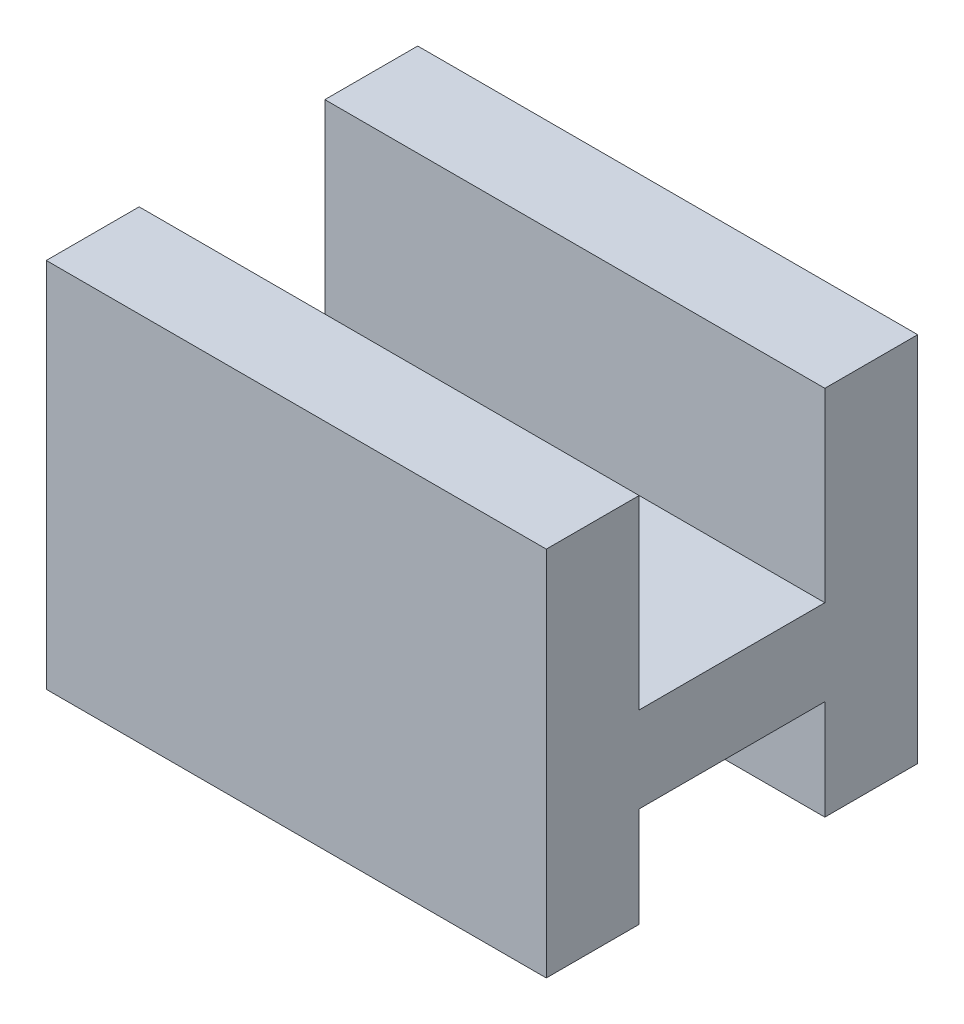
ISO-10303-21;
HEADER;
FILE_DESCRIPTION(('STEP AP214'),'2;1');
FILE_NAME('part.step','',(''),(''),'','','');
FILE_SCHEMA(('AUTOMOTIVE_DESIGN { 1 0 10303 214 1 1 1 1 }'));
ENDSEC;
DATA;
#1=APPLICATION_CONTEXT('core data for automotive mechanical design processes');
#2=APPLICATION_PROTOCOL_DEFINITION('international standard','automotive_design',2000,#1);
#3=PRODUCT_CONTEXT('',#1,'mechanical');
#4=PRODUCT('Part','Part','',(#3));
#5=PRODUCT_RELATED_PRODUCT_CATEGORY('part','',(#4));
#6=PRODUCT_DEFINITION_FORMATION('','',#4);
#7=PRODUCT_DEFINITION_CONTEXT('part definition',#1,'design');
#8=PRODUCT_DEFINITION('design','',#6,#7);
#9=PRODUCT_DEFINITION_SHAPE('','',#8);
#10=(LENGTH_UNIT() NAMED_UNIT(*) SI_UNIT(.MILLI.,.METRE.));
#11=(NAMED_UNIT(*) PLANE_ANGLE_UNIT() SI_UNIT($,.RADIAN.));
#12=(NAMED_UNIT(*) SI_UNIT($,.STERADIAN.) SOLID_ANGLE_UNIT());
#13=UNCERTAINTY_MEASURE_WITH_UNIT(LENGTH_MEASURE(1.E-05),#10,'distance_accuracy_value','');
#14=(GEOMETRIC_REPRESENTATION_CONTEXT(3) GLOBAL_UNCERTAINTY_ASSIGNED_CONTEXT((#13)) GLOBAL_UNIT_ASSIGNED_CONTEXT((#10,
#11,#12)) REPRESENTATION_CONTEXT('',''));
#15=CARTESIAN_POINT('',(0.,0.,0.));
#16=DIRECTION('',(0.,0.,1.));
#17=DIRECTION('',(1.,0.,0.));
#18=AXIS2_PLACEMENT_3D('',#15,#16,#17);
#19=CARTESIAN_POINT('',(-17.5,-13.,26.));
#20=DIRECTION('',(0.,1.,0.));
#21=DIRECTION('',(0.,0.,1.));
#22=AXIS2_PLACEMENT_3D('',#19,#20,#21);
#23=PLANE('',#22);
#24=DIRECTION('',(0.,0.,-1.));
#25=VECTOR('',#24,1.);
#26=CARTESIAN_POINT('',(17.5,-13.,26.));
#27=LINE('',#26,#25);
#28=CARTESIAN_POINT('',(17.5,-13.,6.5));
#29=VERTEX_POINT('',#28);
#30=CARTESIAN_POINT('',(17.5,-13.,0.));
#31=VERTEX_POINT('',#30);
#32=EDGE_CURVE('E139',#29,#31,#27,.T.);
#33=ORIENTED_EDGE('',*,*,#32,.F.);
#34=DIRECTION('',(-1.,0.,0.));
#35=VECTOR('',#34,1.);
#36=CARTESIAN_POINT('',(-17.5,-13.,6.5));
#37=LINE('',#36,#35);
#38=CARTESIAN_POINT('',(-17.5,-13.,6.5));
#39=VERTEX_POINT('',#38);
#40=EDGE_CURVE('E11',#29,#39,#37,.T.);
#41=ORIENTED_EDGE('',*,*,#40,.T.);
#42=DIRECTION('',(0.,0.,-1.));
#43=VECTOR('',#42,1.);
#44=CARTESIAN_POINT('',(-17.5,-13.,26.));
#45=LINE('',#44,#43);
#46=CARTESIAN_POINT('',(-17.5,-13.,0.));
#47=VERTEX_POINT('',#46);
#48=EDGE_CURVE('E137',#39,#47,#45,.T.);
#49=ORIENTED_EDGE('',*,*,#48,.T.);
#50=DIRECTION('',(1.,0.,0.));
#51=VECTOR('',#50,1.);
#52=CARTESIAN_POINT('',(-17.5,-13.,0.));
#53=LINE('',#52,#51);
#54=EDGE_CURVE('E175',#47,#31,#53,.T.);
#55=ORIENTED_EDGE('',*,*,#54,.T.);
#56=EDGE_LOOP('',(#33,#41,#49,#55));
#57=FACE_BOUND('',#56,.T.);
#58=ADVANCED_FACE('F33',(#57),#23,.F.);
#59=CARTESIAN_POINT('',(-17.5,13.,26.));
#60=DIRECTION('',(0.,-1.,0.));
#61=DIRECTION('',(0.,0.,-1.));
#62=AXIS2_PLACEMENT_3D('',#59,#60,#61);
#63=PLANE('',#62);
#64=DIRECTION('',(0.,0.,-1.));
#65=VECTOR('',#64,1.);
#66=CARTESIAN_POINT('',(-17.5,13.,26.));
#67=LINE('',#66,#65);
#68=CARTESIAN_POINT('',(-17.5,13.,6.5));
#69=VERTEX_POINT('',#68);
#70=CARTESIAN_POINT('',(-17.5,13.,0.));
#71=VERTEX_POINT('',#70);
#72=EDGE_CURVE('E148',#69,#71,#67,.T.);
#73=ORIENTED_EDGE('',*,*,#72,.F.);
#74=DIRECTION('',(-1.,0.,0.));
#75=VECTOR('',#74,1.);
#76=CARTESIAN_POINT('',(25.5,13.,6.5));
#77=LINE('',#76,#75);
#78=CARTESIAN_POINT('',(17.5,13.,6.5));
#79=VERTEX_POINT('',#78);
#80=EDGE_CURVE('E216',#79,#69,#77,.T.);
#81=ORIENTED_EDGE('',*,*,#80,.F.);
#82=DIRECTION('',(0.,0.,-1.));
#83=VECTOR('',#82,1.);
#84=CARTESIAN_POINT('',(17.5,13.,26.));
#85=LINE('',#84,#83);
#86=CARTESIAN_POINT('',(17.5,13.,0.));
#87=VERTEX_POINT('',#86);
#88=EDGE_CURVE('E156',#79,#87,#85,.T.);
#89=ORIENTED_EDGE('',*,*,#88,.T.);
#90=DIRECTION('',(-1.,0.,0.));
#91=VECTOR('',#90,1.);
#92=CARTESIAN_POINT('',(-17.5,13.,0.));
#93=LINE('',#92,#91);
#94=EDGE_CURVE('E189',#87,#71,#93,.T.);
#95=ORIENTED_EDGE('',*,*,#94,.T.);
#96=EDGE_LOOP('',(#73,#81,#89,#95));
#97=FACE_BOUND('',#96,.T.);
#98=ADVANCED_FACE('F195',(#97),#63,.F.);
#99=CARTESIAN_POINT('',(17.5,13.,26.));
#100=DIRECTION('',(-1.,0.,0.));
#101=DIRECTION('',(0.,-1.,0.));
#102=AXIS2_PLACEMENT_3D('',#99,#100,#101);
#103=PLANE('',#102);
#104=DIRECTION('',(0.,0.,-1.));
#105=VECTOR('',#104,1.);
#106=CARTESIAN_POINT('',(17.5,-5.99999999999999,26.));
#107=LINE('',#106,#105);
#108=CARTESIAN_POINT('',(17.5,-5.99999999999998,19.5));
#109=VERTEX_POINT('',#108);
#110=CARTESIAN_POINT('',(17.5,-5.99999999999999,6.5));
#111=VERTEX_POINT('',#110);
#112=EDGE_CURVE('E203',#109,#111,#107,.T.);
#113=ORIENTED_EDGE('',*,*,#112,.T.);
#114=DIRECTION('',(0.,-1.,0.));
#115=VECTOR('',#114,1.);
#116=CARTESIAN_POINT('',(17.5,13.,6.5));
#117=LINE('',#116,#115);
#118=EDGE_CURVE('E202',#111,#29,#117,.T.);
#119=ORIENTED_EDGE('',*,*,#118,.T.);
#120=ORIENTED_EDGE('',*,*,#32,.T.);
#121=DIRECTION('',(0.,1.,0.));
#122=VECTOR('',#121,1.);
#123=CARTESIAN_POINT('',(17.5,13.,0.));
#124=LINE('',#123,#122);
#125=EDGE_CURVE('E186',#31,#87,#124,.T.);
#126=ORIENTED_EDGE('',*,*,#125,.T.);
#127=ORIENTED_EDGE('',*,*,#88,.F.);
#128=DIRECTION('',(0.,-1.,0.));
#129=VECTOR('',#128,1.);
#130=CARTESIAN_POINT('',(17.5,13.,6.5));
#131=LINE('',#130,#129);
#132=CARTESIAN_POINT('',(17.5,0.,6.5));
#133=VERTEX_POINT('',#132);
#134=EDGE_CURVE('E180',#79,#133,#131,.T.);
#135=ORIENTED_EDGE('',*,*,#134,.T.);
#136=DIRECTION('',(0.,0.,1.));
#137=VECTOR('',#136,1.);
#138=CARTESIAN_POINT('',(17.5,0.,26.));
#139=LINE('',#138,#137);
#140=CARTESIAN_POINT('',(17.5,0.,19.5));
#141=VERTEX_POINT('',#140);
#142=EDGE_CURVE('E218',#133,#141,#139,.T.);
#143=ORIENTED_EDGE('',*,*,#142,.T.);
#144=DIRECTION('',(0.,1.,0.));
#145=VECTOR('',#144,1.);
#146=CARTESIAN_POINT('',(17.5,13.,19.5));
#147=LINE('',#146,#145);
#148=CARTESIAN_POINT('',(17.5,13.,19.5));
#149=VERTEX_POINT('',#148);
#150=EDGE_CURVE('E226',#141,#149,#147,.T.);
#151=ORIENTED_EDGE('',*,*,#150,.T.);
#152=CARTESIAN_POINT('',(17.5,13.,26.));
#153=VERTEX_POINT('',#152);
#154=EDGE_CURVE('E157',#153,#149,#85,.T.);
#155=ORIENTED_EDGE('',*,*,#154,.F.);
#156=DIRECTION('',(0.,1.,0.));
#157=VECTOR('',#156,1.);
#158=CARTESIAN_POINT('',(17.5,13.,26.));
#159=LINE('',#158,#157);
#160=CARTESIAN_POINT('',(17.5,-13.,26.));
#161=VERTEX_POINT('',#160);
#162=EDGE_CURVE('E171',#161,#153,#159,.T.);
#163=ORIENTED_EDGE('',*,*,#162,.F.);
#164=CARTESIAN_POINT('',(17.5,-13.,19.5));
#165=VERTEX_POINT('',#164);
#166=EDGE_CURVE('E145',#161,#165,#27,.T.);
#167=ORIENTED_EDGE('',*,*,#166,.T.);
#168=DIRECTION('',(0.,1.,0.));
#169=VECTOR('',#168,1.);
#170=CARTESIAN_POINT('',(17.5,13.,19.5));
#171=LINE('',#170,#169);
#172=EDGE_CURVE('E48',#165,#109,#171,.T.);
#173=ORIENTED_EDGE('',*,*,#172,.T.);
#174=EDGE_LOOP('',(#113,#119,#120,#126,#127,#135,#143,#151,#155,#163,#167,#173));
#175=FACE_BOUND('',#174,.T.);
#176=ADVANCED_FACE('F35',(#175),#103,.F.);
#177=ORIENTED_EDGE('',*,*,#154,.T.);
#178=DIRECTION('',(-1.,0.,0.));
#179=VECTOR('',#178,1.);
#180=CARTESIAN_POINT('',(25.5,13.,19.5));
#181=LINE('',#180,#179);
#182=CARTESIAN_POINT('',(-17.5,13.,19.5));
#183=VERTEX_POINT('',#182);
#184=EDGE_CURVE('E219',#149,#183,#181,.T.);
#185=ORIENTED_EDGE('',*,*,#184,.T.);
#186=CARTESIAN_POINT('',(-17.5,13.,26.));
#187=VERTEX_POINT('',#186);
#188=EDGE_CURVE('E153',#187,#183,#67,.T.);
#189=ORIENTED_EDGE('',*,*,#188,.F.);
#190=DIRECTION('',(-1.,0.,0.));
#191=VECTOR('',#190,1.);
#192=CARTESIAN_POINT('',(-17.5,13.,26.));
#193=LINE('',#192,#191);
#194=EDGE_CURVE('E174',#153,#187,#193,.T.);
#195=ORIENTED_EDGE('',*,*,#194,.F.);
#196=EDGE_LOOP('',(#177,#185,#189,#195));
#197=FACE_BOUND('',#196,.T.);
#198=ADVANCED_FACE('F238',(#197),#63,.F.);
#199=CARTESIAN_POINT('',(-17.5,13.,26.));
#200=DIRECTION('',(1.,0.,0.));
#201=DIRECTION('',(0.,1.,0.));
#202=AXIS2_PLACEMENT_3D('',#199,#200,#201);
#203=PLANE('',#202);
#204=ORIENTED_EDGE('',*,*,#48,.F.);
#205=DIRECTION('',(0.,-1.,0.));
#206=VECTOR('',#205,1.);
#207=CARTESIAN_POINT('',(-17.5,-13.,6.5));
#208=LINE('',#207,#206);
#209=CARTESIAN_POINT('',(-17.5,-6.,6.5));
#210=VERTEX_POINT('',#209);
#211=EDGE_CURVE('E123',#210,#39,#208,.T.);
#212=ORIENTED_EDGE('',*,*,#211,.F.);
#213=DIRECTION('',(0.,0.,-1.));
#214=VECTOR('',#213,1.);
#215=CARTESIAN_POINT('',(-17.5,-6.,6.5));
#216=LINE('',#215,#214);
#217=CARTESIAN_POINT('',(-17.5,-5.99999999999999,19.5));
#218=VERTEX_POINT('',#217);
#219=EDGE_CURVE('E240',#218,#210,#216,.T.);
#220=ORIENTED_EDGE('',*,*,#219,.F.);
#221=DIRECTION('',(0.,1.,0.));
#222=VECTOR('',#221,1.);
#223=CARTESIAN_POINT('',(-17.5,-13.,19.5));
#224=LINE('',#223,#222);
#225=CARTESIAN_POINT('',(-17.5,-13.,19.5));
#226=VERTEX_POINT('',#225);
#227=EDGE_CURVE('E132',#226,#218,#224,.T.);
#228=ORIENTED_EDGE('',*,*,#227,.F.);
#229=CARTESIAN_POINT('',(-17.5,-13.,26.));
#230=VERTEX_POINT('',#229);
#231=EDGE_CURVE('E144',#230,#226,#45,.T.);
#232=ORIENTED_EDGE('',*,*,#231,.F.);
#233=DIRECTION('',(0.,-1.,0.));
#234=VECTOR('',#233,1.);
#235=CARTESIAN_POINT('',(-17.5,13.,26.));
#236=LINE('',#235,#234);
#237=EDGE_CURVE('E177',#187,#230,#236,.T.);
#238=ORIENTED_EDGE('',*,*,#237,.F.);
#239=ORIENTED_EDGE('',*,*,#188,.T.);
#240=DIRECTION('',(0.,1.,0.));
#241=VECTOR('',#240,1.);
#242=CARTESIAN_POINT('',(-17.5,13.,19.5));
#243=LINE('',#242,#241);
#244=CARTESIAN_POINT('',(-17.5,0.,19.5));
#245=VERTEX_POINT('',#244);
#246=EDGE_CURVE('E213',#245,#183,#243,.T.);
#247=ORIENTED_EDGE('',*,*,#246,.F.);
#248=DIRECTION('',(0.,0.,1.));
#249=VECTOR('',#248,1.);
#250=CARTESIAN_POINT('',(-17.5,0.,6.5));
#251=LINE('',#250,#249);
#252=CARTESIAN_POINT('',(-17.5,0.,6.5));
#253=VERTEX_POINT('',#252);
#254=EDGE_CURVE('E210',#253,#245,#251,.T.);
#255=ORIENTED_EDGE('',*,*,#254,.F.);
#256=DIRECTION('',(0.,-1.,0.));
#257=VECTOR('',#256,1.);
#258=CARTESIAN_POINT('',(-17.5,13.,6.5));
#259=LINE('',#258,#257);
#260=EDGE_CURVE('E56',#69,#253,#259,.T.);
#261=ORIENTED_EDGE('',*,*,#260,.F.);
#262=ORIENTED_EDGE('',*,*,#72,.T.);
#263=DIRECTION('',(0.,-1.,0.));
#264=VECTOR('',#263,1.);
#265=CARTESIAN_POINT('',(-17.5,13.,0.));
#266=LINE('',#265,#264);
#267=EDGE_CURVE('E142',#71,#47,#266,.T.);
#268=ORIENTED_EDGE('',*,*,#267,.T.);
#269=EDGE_LOOP('',(#204,#212,#220,#228,#232,#238,#239,#247,#255,#261,#262,#268));
#270=FACE_BOUND('',#269,.T.);
#271=ADVANCED_FACE('F140',(#270),#203,.F.);
#272=ORIENTED_EDGE('',*,*,#231,.T.);
#273=DIRECTION('',(1.,0.,0.));
#274=VECTOR('',#273,1.);
#275=CARTESIAN_POINT('',(-17.5,-13.,19.5));
#276=LINE('',#275,#274);
#277=EDGE_CURVE('E41',#226,#165,#276,.T.);
#278=ORIENTED_EDGE('',*,*,#277,.T.);
#279=ORIENTED_EDGE('',*,*,#166,.F.);
#280=DIRECTION('',(1.,0.,0.));
#281=VECTOR('',#280,1.);
#282=CARTESIAN_POINT('',(-17.5,-13.,26.));
#283=LINE('',#282,#281);
#284=EDGE_CURVE('E184',#230,#161,#283,.T.);
#285=ORIENTED_EDGE('',*,*,#284,.F.);
#286=EDGE_LOOP('',(#272,#278,#279,#285));
#287=FACE_BOUND('',#286,.T.);
#288=ADVANCED_FACE('F161',(#287),#23,.F.);
#289=CARTESIAN_POINT('',(0.,0.,26.));
#290=DIRECTION('',(0.,0.,1.));
#291=DIRECTION('',(1.,0.,0.));
#292=AXIS2_PLACEMENT_3D('',#289,#290,#291);
#293=PLANE('',#292);
#294=ORIENTED_EDGE('',*,*,#162,.T.);
#295=ORIENTED_EDGE('',*,*,#194,.T.);
#296=ORIENTED_EDGE('',*,*,#237,.T.);
#297=ORIENTED_EDGE('',*,*,#284,.T.);
#298=EDGE_LOOP('',(#294,#295,#296,#297));
#299=FACE_BOUND('',#298,.T.);
#300=ADVANCED_FACE('F239',(#299),#293,.T.);
#301=CARTESIAN_POINT('',(0.,0.,0.));
#302=DIRECTION('',(0.,0.,1.));
#303=DIRECTION('',(1.,0.,0.));
#304=AXIS2_PLACEMENT_3D('',#301,#302,#303);
#305=PLANE('',#304);
#306=ORIENTED_EDGE('',*,*,#125,.F.);
#307=ORIENTED_EDGE('',*,*,#54,.F.);
#308=ORIENTED_EDGE('',*,*,#267,.F.);
#309=ORIENTED_EDGE('',*,*,#94,.F.);
#310=EDGE_LOOP('',(#306,#307,#308,#309));
#311=FACE_BOUND('',#310,.T.);
#312=ADVANCED_FACE('F200',(#311),#305,.F.);
#313=CARTESIAN_POINT('',(25.5,13.,6.5));
#314=DIRECTION('',(0.,0.,-1.));
#315=DIRECTION('',(0.,1.,0.));
#316=AXIS2_PLACEMENT_3D('',#313,#314,#315);
#317=PLANE('',#316);
#318=ORIENTED_EDGE('',*,*,#80,.T.);
#319=ORIENTED_EDGE('',*,*,#260,.T.);
#320=DIRECTION('',(-1.,0.,0.));
#321=VECTOR('',#320,1.);
#322=CARTESIAN_POINT('',(25.5,0.,6.5));
#323=LINE('',#322,#321);
#324=EDGE_CURVE('E215',#133,#253,#323,.T.);
#325=ORIENTED_EDGE('',*,*,#324,.F.);
#326=ORIENTED_EDGE('',*,*,#134,.F.);
#327=EDGE_LOOP('',(#318,#319,#325,#326));
#328=FACE_BOUND('',#327,.T.);
#329=ADVANCED_FACE('F227',(#328),#317,.F.);
#330=CARTESIAN_POINT('',(25.5,13.,19.5));
#331=DIRECTION('',(0.,0.,1.));
#332=DIRECTION('',(1.,0.,0.));
#333=AXIS2_PLACEMENT_3D('',#330,#331,#332);
#334=PLANE('',#333);
#335=DIRECTION('',(-1.,0.,0.));
#336=VECTOR('',#335,1.);
#337=CARTESIAN_POINT('',(25.5,0.,19.5));
#338=LINE('',#337,#336);
#339=EDGE_CURVE('E222',#141,#245,#338,.T.);
#340=ORIENTED_EDGE('',*,*,#339,.T.);
#341=ORIENTED_EDGE('',*,*,#246,.T.);
#342=ORIENTED_EDGE('',*,*,#184,.F.);
#343=ORIENTED_EDGE('',*,*,#150,.F.);
#344=EDGE_LOOP('',(#340,#341,#342,#343));
#345=FACE_BOUND('',#344,.T.);
#346=ADVANCED_FACE('F236',(#345),#334,.F.);
#347=CARTESIAN_POINT('',(25.5,0.,6.5));
#348=DIRECTION('',(0.,-1.,0.));
#349=DIRECTION('',(1.,0.,0.));
#350=AXIS2_PLACEMENT_3D('',#347,#348,#349);
#351=PLANE('',#350);
#352=ORIENTED_EDGE('',*,*,#324,.T.);
#353=ORIENTED_EDGE('',*,*,#254,.T.);
#354=ORIENTED_EDGE('',*,*,#339,.F.);
#355=ORIENTED_EDGE('',*,*,#142,.F.);
#356=EDGE_LOOP('',(#352,#353,#354,#355));
#357=FACE_BOUND('',#356,.T.);
#358=ADVANCED_FACE('F230',(#357),#351,.F.);
#359=CARTESIAN_POINT('',(25.5,-5.99999999999998,6.5));
#360=DIRECTION('',(0.,1.,0.));
#361=DIRECTION('',(-1.,0.,0.));
#362=AXIS2_PLACEMENT_3D('',#359,#360,#361);
#363=PLANE('',#362);
#364=DIRECTION('',(-1.,0.,0.));
#365=VECTOR('',#364,1.);
#366=CARTESIAN_POINT('',(25.5,-5.99999999999998,19.5));
#367=LINE('',#366,#365);
#368=EDGE_CURVE('E242',#109,#218,#367,.T.);
#369=ORIENTED_EDGE('',*,*,#368,.T.);
#370=ORIENTED_EDGE('',*,*,#219,.T.);
#371=DIRECTION('',(-1.,0.,0.));
#372=VECTOR('',#371,1.);
#373=CARTESIAN_POINT('',(25.5,-5.99999999999998,6.5));
#374=LINE('',#373,#372);
#375=EDGE_CURVE('E127',#111,#210,#374,.T.);
#376=ORIENTED_EDGE('',*,*,#375,.F.);
#377=ORIENTED_EDGE('',*,*,#112,.F.);
#378=EDGE_LOOP('',(#369,#370,#376,#377));
#379=FACE_BOUND('',#378,.T.);
#380=ADVANCED_FACE('F246',(#379),#363,.F.);
#381=CARTESIAN_POINT('',(25.5,-13.,6.5));
#382=DIRECTION('',(0.,0.,-1.));
#383=DIRECTION('',(-1.,0.,0.));
#384=AXIS2_PLACEMENT_3D('',#381,#382,#383);
#385=PLANE('',#384);
#386=ORIENTED_EDGE('',*,*,#375,.T.);
#387=ORIENTED_EDGE('',*,*,#211,.T.);
#388=ORIENTED_EDGE('',*,*,#40,.F.);
#389=ORIENTED_EDGE('',*,*,#118,.F.);
#390=EDGE_LOOP('',(#386,#387,#388,#389));
#391=FACE_BOUND('',#390,.T.);
#392=ADVANCED_FACE('F124',(#391),#385,.F.);
#393=CARTESIAN_POINT('',(25.5,-13.,19.5));
#394=DIRECTION('',(0.,0.,1.));
#395=DIRECTION('',(1.,0.,0.));
#396=AXIS2_PLACEMENT_3D('',#393,#394,#395);
#397=PLANE('',#396);
#398=ORIENTED_EDGE('',*,*,#277,.F.);
#399=ORIENTED_EDGE('',*,*,#227,.T.);
#400=ORIENTED_EDGE('',*,*,#368,.F.);
#401=ORIENTED_EDGE('',*,*,#172,.F.);
#402=EDGE_LOOP('',(#398,#399,#400,#401));
#403=FACE_BOUND('',#402,.T.);
#404=ADVANCED_FACE('F247',(#403),#397,.F.);
#405=CLOSED_SHELL('',(#58,#98,#176,#198,#271,#288,#300,#312,#329,#346,#358,#380,#392,#404));
#406=MANIFOLD_SOLID_BREP('B2',#405);
#407=ADVANCED_BREP_SHAPE_REPRESENTATION('',(#18,#406),#14);
#408=SHAPE_DEFINITION_REPRESENTATION(#9,#407);
ENDSEC;
END-ISO-10303-21;
